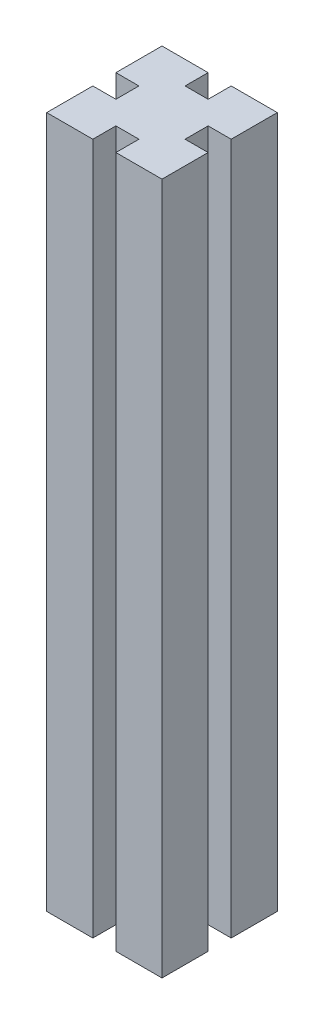
ISO-10303-21;
HEADER;
FILE_DESCRIPTION(('STEP AP214'),'2;1');
FILE_NAME('part.step','',(''),(''),'','','');
FILE_SCHEMA(('AUTOMOTIVE_DESIGN { 1 0 10303 214 1 1 1 1 }'));
ENDSEC;
DATA;
#1=APPLICATION_CONTEXT('core data for automotive mechanical design processes');
#2=APPLICATION_PROTOCOL_DEFINITION('international standard','automotive_design',2000,#1);
#3=PRODUCT_CONTEXT('',#1,'mechanical');
#4=PRODUCT('Part','Part','',(#3));
#5=PRODUCT_RELATED_PRODUCT_CATEGORY('part','',(#4));
#6=PRODUCT_DEFINITION_FORMATION('','',#4);
#7=PRODUCT_DEFINITION_CONTEXT('part definition',#1,'design');
#8=PRODUCT_DEFINITION('design','',#6,#7);
#9=PRODUCT_DEFINITION_SHAPE('','',#8);
#10=(LENGTH_UNIT() NAMED_UNIT(*) SI_UNIT(.MILLI.,.METRE.));
#11=(NAMED_UNIT(*) PLANE_ANGLE_UNIT() SI_UNIT($,.RADIAN.));
#12=(NAMED_UNIT(*) SI_UNIT($,.STERADIAN.) SOLID_ANGLE_UNIT());
#13=UNCERTAINTY_MEASURE_WITH_UNIT(LENGTH_MEASURE(1.E-05),#10,'distance_accuracy_value','');
#14=(GEOMETRIC_REPRESENTATION_CONTEXT(3) GLOBAL_UNCERTAINTY_ASSIGNED_CONTEXT((#13)) GLOBAL_UNIT_ASSIGNED_CONTEXT((#10,
#11,#12)) REPRESENTATION_CONTEXT('',''));
#15=CARTESIAN_POINT('',(0.,0.,0.));
#16=DIRECTION('',(0.,0.,1.));
#17=DIRECTION('',(1.,0.,0.));
#18=AXIS2_PLACEMENT_3D('',#15,#16,#17);
#19=CARTESIAN_POINT('',(12.5,150.,-12.5));
#20=DIRECTION('',(-1.,0.,0.));
#21=DIRECTION('',(0.,0.,1.));
#22=AXIS2_PLACEMENT_3D('',#19,#20,#21);
#23=PLANE('',#22);
#24=DIRECTION('',(0.,0.,-1.));
#25=VECTOR('',#24,1.);
#26=CARTESIAN_POINT('',(12.5,0.,-12.5));
#27=LINE('',#26,#25);
#28=CARTESIAN_POINT('',(12.5,0.,12.5));
#29=VERTEX_POINT('',#28);
#30=CARTESIAN_POINT('',(12.5,0.,2.50000000000001));
#31=VERTEX_POINT('',#30);
#32=EDGE_CURVE('E288',#29,#31,#27,.T.);
#33=ORIENTED_EDGE('',*,*,#32,.T.);
#34=DIRECTION('',(0.,1.,0.));
#35=VECTOR('',#34,1.);
#36=CARTESIAN_POINT('',(12.5,150.,2.50000000000001));
#37=LINE('',#36,#35);
#38=CARTESIAN_POINT('',(12.5,150.,2.50000000000001));
#39=VERTEX_POINT('',#38);
#40=EDGE_CURVE('E183',#31,#39,#37,.T.);
#41=ORIENTED_EDGE('',*,*,#40,.T.);
#42=DIRECTION('',(0.,0.,-1.));
#43=VECTOR('',#42,1.);
#44=CARTESIAN_POINT('',(12.5,150.,-12.5));
#45=LINE('',#44,#43);
#46=CARTESIAN_POINT('',(12.5,150.,12.5));
#47=VERTEX_POINT('',#46);
#48=EDGE_CURVE('E271',#47,#39,#45,.T.);
#49=ORIENTED_EDGE('',*,*,#48,.F.);
#50=DIRECTION('',(0.,-1.,0.));
#51=VECTOR('',#50,1.);
#52=CARTESIAN_POINT('',(12.5,150.,12.5));
#53=LINE('',#52,#51);
#54=EDGE_CURVE('E287',#47,#29,#53,.T.);
#55=ORIENTED_EDGE('',*,*,#54,.T.);
#56=EDGE_LOOP('',(#33,#41,#49,#55));
#57=FACE_BOUND('',#56,.T.);
#58=ADVANCED_FACE('F32',(#57),#23,.F.);
#59=CARTESIAN_POINT('',(-12.5,150.,-12.5));
#60=DIRECTION('',(1.,0.,0.));
#61=DIRECTION('',(0.,0.,-1.));
#62=AXIS2_PLACEMENT_3D('',#59,#60,#61);
#63=PLANE('',#62);
#64=DIRECTION('',(0.,0.,1.));
#65=VECTOR('',#64,1.);
#66=CARTESIAN_POINT('',(-12.5,0.,-12.5));
#67=LINE('',#66,#65);
#68=CARTESIAN_POINT('',(-12.5,0.,-12.5));
#69=VERTEX_POINT('',#68);
#70=CARTESIAN_POINT('',(-12.5,0.,-2.5));
#71=VERTEX_POINT('',#70);
#72=EDGE_CURVE('E295',#69,#71,#67,.T.);
#73=ORIENTED_EDGE('',*,*,#72,.T.);
#74=DIRECTION('',(0.,1.,0.));
#75=VECTOR('',#74,1.);
#76=CARTESIAN_POINT('',(-12.5,150.,-2.5));
#77=LINE('',#76,#75);
#78=CARTESIAN_POINT('',(-12.5,150.,-2.5));
#79=VERTEX_POINT('',#78);
#80=EDGE_CURVE('E233',#71,#79,#77,.T.);
#81=ORIENTED_EDGE('',*,*,#80,.T.);
#82=DIRECTION('',(0.,0.,1.));
#83=VECTOR('',#82,1.);
#84=CARTESIAN_POINT('',(-12.5,150.,-12.5));
#85=LINE('',#84,#83);
#86=CARTESIAN_POINT('',(-12.5,150.,-12.5));
#87=VERTEX_POINT('',#86);
#88=EDGE_CURVE('E280',#87,#79,#85,.T.);
#89=ORIENTED_EDGE('',*,*,#88,.F.);
#90=DIRECTION('',(0.,-1.,0.));
#91=VECTOR('',#90,1.);
#92=CARTESIAN_POINT('',(-12.5,150.,-12.5));
#93=LINE('',#92,#91);
#94=EDGE_CURVE('E307',#87,#69,#93,.T.);
#95=ORIENTED_EDGE('',*,*,#94,.T.);
#96=EDGE_LOOP('',(#73,#81,#89,#95));
#97=FACE_BOUND('',#96,.T.);
#98=ADVANCED_FACE('F358',(#97),#63,.F.);
#99=CARTESIAN_POINT('',(-12.5,150.,12.5));
#100=DIRECTION('',(0.,0.,-1.));
#101=DIRECTION('',(-1.,0.,0.));
#102=AXIS2_PLACEMENT_3D('',#99,#100,#101);
#103=PLANE('',#102);
#104=DIRECTION('',(1.,0.,0.));
#105=VECTOR('',#104,1.);
#106=CARTESIAN_POINT('',(-12.5,0.,12.5));
#107=LINE('',#106,#105);
#108=CARTESIAN_POINT('',(-12.5,0.,12.5));
#109=VERTEX_POINT('',#108);
#110=CARTESIAN_POINT('',(-2.5,0.,12.5));
#111=VERTEX_POINT('',#110);
#112=EDGE_CURVE('E299',#109,#111,#107,.T.);
#113=ORIENTED_EDGE('',*,*,#112,.T.);
#114=DIRECTION('',(0.,1.,0.));
#115=VECTOR('',#114,1.);
#116=CARTESIAN_POINT('',(-2.5,150.,12.5));
#117=LINE('',#116,#115);
#118=CARTESIAN_POINT('',(-2.5,150.,12.5));
#119=VERTEX_POINT('',#118);
#120=EDGE_CURVE('E239',#111,#119,#117,.T.);
#121=ORIENTED_EDGE('',*,*,#120,.T.);
#122=DIRECTION('',(1.,0.,0.));
#123=VECTOR('',#122,1.);
#124=CARTESIAN_POINT('',(-12.5,150.,12.5));
#125=LINE('',#124,#123);
#126=CARTESIAN_POINT('',(-12.5,150.,12.5));
#127=VERTEX_POINT('',#126);
#128=EDGE_CURVE('E284',#127,#119,#125,.T.);
#129=ORIENTED_EDGE('',*,*,#128,.F.);
#130=DIRECTION('',(0.,-1.,0.));
#131=VECTOR('',#130,1.);
#132=CARTESIAN_POINT('',(-12.5,150.,12.5));
#133=LINE('',#132,#131);
#134=EDGE_CURVE('E304',#127,#109,#133,.T.);
#135=ORIENTED_EDGE('',*,*,#134,.T.);
#136=EDGE_LOOP('',(#113,#121,#129,#135));
#137=FACE_BOUND('',#136,.T.);
#138=ADVANCED_FACE('F338',(#137),#103,.F.);
#139=CARTESIAN_POINT('',(-12.5,150.,-12.5));
#140=DIRECTION('',(0.,0.,1.));
#141=DIRECTION('',(1.,0.,0.));
#142=AXIS2_PLACEMENT_3D('',#139,#140,#141);
#143=PLANE('',#142);
#144=DIRECTION('',(-1.,0.,0.));
#145=VECTOR('',#144,1.);
#146=CARTESIAN_POINT('',(-12.5,0.,-12.5));
#147=LINE('',#146,#145);
#148=CARTESIAN_POINT('',(12.5,0.,-12.5));
#149=VERTEX_POINT('',#148);
#150=CARTESIAN_POINT('',(2.50000000000001,0.,-12.5));
#151=VERTEX_POINT('',#150);
#152=EDGE_CURVE('E291',#149,#151,#147,.T.);
#153=ORIENTED_EDGE('',*,*,#152,.T.);
#154=DIRECTION('',(0.,1.,0.));
#155=VECTOR('',#154,1.);
#156=CARTESIAN_POINT('',(2.50000000000001,150.,-12.5));
#157=LINE('',#156,#155);
#158=CARTESIAN_POINT('',(2.50000000000001,150.,-12.5));
#159=VERTEX_POINT('',#158);
#160=EDGE_CURVE('E267',#151,#159,#157,.T.);
#161=ORIENTED_EDGE('',*,*,#160,.T.);
#162=DIRECTION('',(-1.,0.,0.));
#163=VECTOR('',#162,1.);
#164=CARTESIAN_POINT('',(-12.5,150.,-12.5));
#165=LINE('',#164,#163);
#166=CARTESIAN_POINT('',(12.5,150.,-12.5));
#167=VERTEX_POINT('',#166);
#168=EDGE_CURVE('E276',#167,#159,#165,.T.);
#169=ORIENTED_EDGE('',*,*,#168,.F.);
#170=DIRECTION('',(0.,-1.,0.));
#171=VECTOR('',#170,1.);
#172=CARTESIAN_POINT('',(12.5,150.,-12.5));
#173=LINE('',#172,#171);
#174=EDGE_CURVE('E310',#167,#149,#173,.T.);
#175=ORIENTED_EDGE('',*,*,#174,.T.);
#176=EDGE_LOOP('',(#153,#161,#169,#175));
#177=FACE_BOUND('',#176,.T.);
#178=ADVANCED_FACE('F377',(#177),#143,.F.);
#179=CARTESIAN_POINT('',(12.5,150.,-2.49999999999999));
#180=VERTEX_POINT('',#179);
#181=EDGE_CURVE('E275',#180,#167,#45,.T.);
#182=ORIENTED_EDGE('',*,*,#181,.F.);
#183=DIRECTION('',(0.,-1.,0.));
#184=VECTOR('',#183,1.);
#185=CARTESIAN_POINT('',(12.5,150.,-2.5));
#186=LINE('',#185,#184);
#187=CARTESIAN_POINT('',(12.5,0.,-2.49999999999999));
#188=VERTEX_POINT('',#187);
#189=EDGE_CURVE('E242',#180,#188,#186,.T.);
#190=ORIENTED_EDGE('',*,*,#189,.T.);
#191=EDGE_CURVE('E270',#188,#149,#27,.T.);
#192=ORIENTED_EDGE('',*,*,#191,.T.);
#193=ORIENTED_EDGE('',*,*,#174,.F.);
#194=EDGE_LOOP('',(#182,#190,#192,#193));
#195=FACE_BOUND('',#194,.T.);
#196=ADVANCED_FACE('F34',(#195),#23,.F.);
#197=CARTESIAN_POINT('',(-2.49999999999999,150.,-12.5));
#198=VERTEX_POINT('',#197);
#199=EDGE_CURVE('E274',#198,#87,#165,.T.);
#200=ORIENTED_EDGE('',*,*,#199,.F.);
#201=DIRECTION('',(0.,-1.,0.));
#202=VECTOR('',#201,1.);
#203=CARTESIAN_POINT('',(-2.49999999999999,150.,-12.5));
#204=LINE('',#203,#202);
#205=CARTESIAN_POINT('',(-2.49999999999999,0.,-12.5));
#206=VERTEX_POINT('',#205);
#207=EDGE_CURVE('E262',#198,#206,#204,.T.);
#208=ORIENTED_EDGE('',*,*,#207,.T.);
#209=EDGE_CURVE('E290',#206,#69,#147,.T.);
#210=ORIENTED_EDGE('',*,*,#209,.T.);
#211=ORIENTED_EDGE('',*,*,#94,.F.);
#212=EDGE_LOOP('',(#200,#208,#210,#211));
#213=FACE_BOUND('',#212,.T.);
#214=ADVANCED_FACE('F363',(#213),#143,.F.);
#215=CARTESIAN_POINT('',(-12.5,150.,2.5));
#216=VERTEX_POINT('',#215);
#217=EDGE_CURVE('E279',#216,#127,#85,.T.);
#218=ORIENTED_EDGE('',*,*,#217,.F.);
#219=DIRECTION('',(0.,-1.,0.));
#220=VECTOR('',#219,1.);
#221=CARTESIAN_POINT('',(-12.5,150.,2.5));
#222=LINE('',#221,#220);
#223=CARTESIAN_POINT('',(-12.5,0.,2.5));
#224=VERTEX_POINT('',#223);
#225=EDGE_CURVE('E176',#216,#224,#222,.T.);
#226=ORIENTED_EDGE('',*,*,#225,.T.);
#227=EDGE_CURVE('E294',#224,#109,#67,.T.);
#228=ORIENTED_EDGE('',*,*,#227,.T.);
#229=ORIENTED_EDGE('',*,*,#134,.F.);
#230=EDGE_LOOP('',(#218,#226,#228,#229));
#231=FACE_BOUND('',#230,.T.);
#232=ADVANCED_FACE('F344',(#231),#63,.F.);
#233=CARTESIAN_POINT('',(2.5,150.,12.5));
#234=VERTEX_POINT('',#233);
#235=EDGE_CURVE('E283',#234,#47,#125,.T.);
#236=ORIENTED_EDGE('',*,*,#235,.F.);
#237=DIRECTION('',(0.,-1.,0.));
#238=VECTOR('',#237,1.);
#239=CARTESIAN_POINT('',(2.5,150.,12.5));
#240=LINE('',#239,#238);
#241=CARTESIAN_POINT('',(2.5,0.,12.5));
#242=VERTEX_POINT('',#241);
#243=EDGE_CURVE('E236',#234,#242,#240,.T.);
#244=ORIENTED_EDGE('',*,*,#243,.T.);
#245=EDGE_CURVE('E298',#242,#29,#107,.T.);
#246=ORIENTED_EDGE('',*,*,#245,.T.);
#247=ORIENTED_EDGE('',*,*,#54,.F.);
#248=EDGE_LOOP('',(#236,#244,#246,#247));
#249=FACE_BOUND('',#248,.T.);
#250=ADVANCED_FACE('F325',(#249),#103,.F.);
#251=CARTESIAN_POINT('',(0.,150.,0.));
#252=DIRECTION('',(0.,1.,0.));
#253=DIRECTION('',(0.,0.,1.));
#254=AXIS2_PLACEMENT_3D('',#251,#252,#253);
#255=PLANE('',#254);
#256=DIRECTION('',(1.,0.,0.));
#257=VECTOR('',#256,1.);
#258=CARTESIAN_POINT('',(17.5,150.,2.5));
#259=LINE('',#258,#257);
#260=CARTESIAN_POINT('',(7.5,150.,2.50000000000001));
#261=VERTEX_POINT('',#260);
#262=EDGE_CURVE('E193',#261,#39,#259,.T.);
#263=ORIENTED_EDGE('',*,*,#262,.F.);
#264=DIRECTION('',(0.,0.,1.));
#265=VECTOR('',#264,1.);
#266=CARTESIAN_POINT('',(7.5,150.,-2.49999999999999));
#267=LINE('',#266,#265);
#268=CARTESIAN_POINT('',(7.5,150.,-2.49999999999999));
#269=VERTEX_POINT('',#268);
#270=EDGE_CURVE('E173',#269,#261,#267,.T.);
#271=ORIENTED_EDGE('',*,*,#270,.F.);
#272=DIRECTION('',(-1.,0.,0.));
#273=VECTOR('',#272,1.);
#274=CARTESIAN_POINT('',(17.5,150.,-2.49999999999999));
#275=LINE('',#274,#273);
#276=EDGE_CURVE('E195',#180,#269,#275,.T.);
#277=ORIENTED_EDGE('',*,*,#276,.F.);
#278=ORIENTED_EDGE('',*,*,#181,.T.);
#279=ORIENTED_EDGE('',*,*,#168,.T.);
#280=DIRECTION('',(0.,0.,-1.));
#281=VECTOR('',#280,1.);
#282=CARTESIAN_POINT('',(2.50000000000001,150.,-17.5));
#283=LINE('',#282,#281);
#284=CARTESIAN_POINT('',(2.50000000000001,150.,-7.5));
#285=VERTEX_POINT('',#284);
#286=EDGE_CURVE('E246',#285,#159,#283,.T.);
#287=ORIENTED_EDGE('',*,*,#286,.F.);
#288=DIRECTION('',(1.,0.,0.));
#289=VECTOR('',#288,1.);
#290=CARTESIAN_POINT('',(-2.49999999999999,150.,-7.5));
#291=LINE('',#290,#289);
#292=CARTESIAN_POINT('',(-2.49999999999999,150.,-7.5));
#293=VERTEX_POINT('',#292);
#294=EDGE_CURVE('E251',#293,#285,#291,.T.);
#295=ORIENTED_EDGE('',*,*,#294,.F.);
#296=DIRECTION('',(0.,0.,1.));
#297=VECTOR('',#296,1.);
#298=CARTESIAN_POINT('',(-2.49999999999999,150.,-17.5));
#299=LINE('',#298,#297);
#300=EDGE_CURVE('E256',#198,#293,#299,.T.);
#301=ORIENTED_EDGE('',*,*,#300,.F.);
#302=ORIENTED_EDGE('',*,*,#199,.T.);
#303=ORIENTED_EDGE('',*,*,#88,.T.);
#304=DIRECTION('',(-1.,0.,0.));
#305=VECTOR('',#304,1.);
#306=CARTESIAN_POINT('',(-17.5,150.,-2.5));
#307=LINE('',#306,#305);
#308=CARTESIAN_POINT('',(-7.5,150.,-2.50000000000001));
#309=VERTEX_POINT('',#308);
#310=EDGE_CURVE('E222',#309,#79,#307,.T.);
#311=ORIENTED_EDGE('',*,*,#310,.F.);
#312=DIRECTION('',(0.,0.,-1.));
#313=VECTOR('',#312,1.);
#314=CARTESIAN_POINT('',(-7.5,150.,2.5));
#315=LINE('',#314,#313);
#316=CARTESIAN_POINT('',(-7.5,150.,2.5));
#317=VERTEX_POINT('',#316);
#318=EDGE_CURVE('E218',#317,#309,#315,.T.);
#319=ORIENTED_EDGE('',*,*,#318,.F.);
#320=DIRECTION('',(1.,0.,0.));
#321=VECTOR('',#320,1.);
#322=CARTESIAN_POINT('',(-17.5,150.,2.5));
#323=LINE('',#322,#321);
#324=EDGE_CURVE('E224',#216,#317,#323,.T.);
#325=ORIENTED_EDGE('',*,*,#324,.F.);
#326=ORIENTED_EDGE('',*,*,#217,.T.);
#327=ORIENTED_EDGE('',*,*,#128,.T.);
#328=DIRECTION('',(0.,0.,1.));
#329=VECTOR('',#328,1.);
#330=CARTESIAN_POINT('',(-2.5,150.,17.5));
#331=LINE('',#330,#329);
#332=CARTESIAN_POINT('',(-2.50000000000001,150.,7.5));
#333=VERTEX_POINT('',#332);
#334=EDGE_CURVE('E205',#333,#119,#331,.T.);
#335=ORIENTED_EDGE('',*,*,#334,.F.);
#336=DIRECTION('',(-1.,0.,0.));
#337=VECTOR('',#336,1.);
#338=CARTESIAN_POINT('',(2.5,150.,7.5));
#339=LINE('',#338,#337);
#340=CARTESIAN_POINT('',(2.5,150.,7.5));
#341=VERTEX_POINT('',#340);
#342=EDGE_CURVE('E202',#341,#333,#339,.T.);
#343=ORIENTED_EDGE('',*,*,#342,.F.);
#344=DIRECTION('',(0.,0.,-1.));
#345=VECTOR('',#344,1.);
#346=CARTESIAN_POINT('',(2.5,150.,17.5));
#347=LINE('',#346,#345);
#348=EDGE_CURVE('E207',#234,#341,#347,.T.);
#349=ORIENTED_EDGE('',*,*,#348,.F.);
#350=ORIENTED_EDGE('',*,*,#235,.T.);
#351=ORIENTED_EDGE('',*,*,#48,.T.);
#352=EDGE_LOOP('',(#263,#271,#277,#278,#279,#287,#295,#301,#302,#303,#311,#319,#325,#326,#327,
#335,#343,#349,#350,#351));
#353=FACE_BOUND('',#352,.T.);
#354=ADVANCED_FACE('F329',(#353),#255,.T.);
#355=CARTESIAN_POINT('',(0.,0.,0.));
#356=DIRECTION('',(0.,1.,0.));
#357=DIRECTION('',(0.,0.,1.));
#358=AXIS2_PLACEMENT_3D('',#355,#356,#357);
#359=PLANE('',#358);
#360=DIRECTION('',(0.,0.,1.));
#361=VECTOR('',#360,1.);
#362=CARTESIAN_POINT('',(7.5,0.,-2.49999999999999));
#363=LINE('',#362,#361);
#364=CARTESIAN_POINT('',(7.5,0.,-2.49999999999999));
#365=VERTEX_POINT('',#364);
#366=CARTESIAN_POINT('',(7.5,0.,2.50000000000001));
#367=VERTEX_POINT('',#366);
#368=EDGE_CURVE('E47',#365,#367,#363,.T.);
#369=ORIENTED_EDGE('',*,*,#368,.T.);
#370=DIRECTION('',(1.,0.,0.));
#371=VECTOR('',#370,1.);
#372=CARTESIAN_POINT('',(17.5,0.,2.5));
#373=LINE('',#372,#371);
#374=EDGE_CURVE('E180',#367,#31,#373,.T.);
#375=ORIENTED_EDGE('',*,*,#374,.T.);
#376=ORIENTED_EDGE('',*,*,#32,.F.);
#377=ORIENTED_EDGE('',*,*,#245,.F.);
#378=DIRECTION('',(0.,0.,-1.));
#379=VECTOR('',#378,1.);
#380=CARTESIAN_POINT('',(2.49999999999999,0.,0.));
#381=LINE('',#380,#379);
#382=CARTESIAN_POINT('',(2.5,0.,7.5));
#383=VERTEX_POINT('',#382);
#384=EDGE_CURVE('E40',#242,#383,#381,.T.);
#385=ORIENTED_EDGE('',*,*,#384,.T.);
#386=DIRECTION('',(-1.,0.,0.));
#387=VECTOR('',#386,1.);
#388=CARTESIAN_POINT('',(2.5,0.,7.5));
#389=LINE('',#388,#387);
#390=CARTESIAN_POINT('',(-2.50000000000001,0.,7.5));
#391=VERTEX_POINT('',#390);
#392=EDGE_CURVE('E55',#383,#391,#389,.T.);
#393=ORIENTED_EDGE('',*,*,#392,.T.);
#394=DIRECTION('',(0.,0.,1.));
#395=VECTOR('',#394,1.);
#396=CARTESIAN_POINT('',(-2.5,0.,17.5));
#397=LINE('',#396,#395);
#398=EDGE_CURVE('E199',#391,#111,#397,.T.);
#399=ORIENTED_EDGE('',*,*,#398,.T.);
#400=ORIENTED_EDGE('',*,*,#112,.F.);
#401=ORIENTED_EDGE('',*,*,#227,.F.);
#402=DIRECTION('',(1.,0.,0.));
#403=VECTOR('',#402,1.);
#404=CARTESIAN_POINT('',(0.,0.,2.49999999999999));
#405=LINE('',#404,#403);
#406=CARTESIAN_POINT('',(-7.5,0.,2.5));
#407=VERTEX_POINT('',#406);
#408=EDGE_CURVE('E316',#224,#407,#405,.T.);
#409=ORIENTED_EDGE('',*,*,#408,.T.);
#410=DIRECTION('',(0.,0.,-1.));
#411=VECTOR('',#410,1.);
#412=CARTESIAN_POINT('',(-7.5,0.,2.5));
#413=LINE('',#412,#411);
#414=CARTESIAN_POINT('',(-7.5,0.,-2.50000000000001));
#415=VERTEX_POINT('',#414);
#416=EDGE_CURVE('E217',#407,#415,#413,.T.);
#417=ORIENTED_EDGE('',*,*,#416,.T.);
#418=DIRECTION('',(-1.,0.,0.));
#419=VECTOR('',#418,1.);
#420=CARTESIAN_POINT('',(-17.5,0.,-2.5));
#421=LINE('',#420,#419);
#422=EDGE_CURVE('E214',#415,#71,#421,.T.);
#423=ORIENTED_EDGE('',*,*,#422,.T.);
#424=ORIENTED_EDGE('',*,*,#72,.F.);
#425=ORIENTED_EDGE('',*,*,#209,.F.);
#426=DIRECTION('',(0.,0.,1.));
#427=VECTOR('',#426,1.);
#428=CARTESIAN_POINT('',(-2.49999999999999,0.,0.));
#429=LINE('',#428,#427);
#430=CARTESIAN_POINT('',(-2.49999999999999,0.,-7.5));
#431=VERTEX_POINT('',#430);
#432=EDGE_CURVE('E313',#206,#431,#429,.T.);
#433=ORIENTED_EDGE('',*,*,#432,.T.);
#434=DIRECTION('',(1.,0.,0.));
#435=VECTOR('',#434,1.);
#436=CARTESIAN_POINT('',(-2.49999999999999,0.,-7.5));
#437=LINE('',#436,#435);
#438=CARTESIAN_POINT('',(2.50000000000001,0.,-7.5));
#439=VERTEX_POINT('',#438);
#440=EDGE_CURVE('E250',#431,#439,#437,.T.);
#441=ORIENTED_EDGE('',*,*,#440,.T.);
#442=DIRECTION('',(0.,0.,-1.));
#443=VECTOR('',#442,1.);
#444=CARTESIAN_POINT('',(2.50000000000001,0.,-17.5));
#445=LINE('',#444,#443);
#446=EDGE_CURVE('E247',#439,#151,#445,.T.);
#447=ORIENTED_EDGE('',*,*,#446,.T.);
#448=ORIENTED_EDGE('',*,*,#152,.F.);
#449=ORIENTED_EDGE('',*,*,#191,.F.);
#450=DIRECTION('',(-1.,0.,0.));
#451=VECTOR('',#450,1.);
#452=CARTESIAN_POINT('',(0.,0.,-2.49999999999999));
#453=LINE('',#452,#451);
#454=EDGE_CURVE('E11',#188,#365,#453,.T.);
#455=ORIENTED_EDGE('',*,*,#454,.T.);
#456=EDGE_LOOP('',(#369,#375,#376,#377,#385,#393,#399,#400,#401,#409,#417,#423,#424,#425,#433,
#441,#447,#448,#449,#455));
#457=FACE_BOUND('',#456,.T.);
#458=ADVANCED_FACE('F188',(#457),#359,.F.);
#459=CARTESIAN_POINT('',(2.50000000000001,0.,-17.5));
#460=DIRECTION('',(1.,0.,0.));
#461=DIRECTION('',(0.,0.,-1.));
#462=AXIS2_PLACEMENT_3D('',#459,#460,#461);
#463=PLANE('',#462);
#464=ORIENTED_EDGE('',*,*,#446,.F.);
#465=DIRECTION('',(0.,1.,0.));
#466=VECTOR('',#465,1.);
#467=CARTESIAN_POINT('',(2.50000000000001,0.,-7.5));
#468=LINE('',#467,#466);
#469=EDGE_CURVE('E260',#439,#285,#468,.T.);
#470=ORIENTED_EDGE('',*,*,#469,.T.);
#471=ORIENTED_EDGE('',*,*,#286,.T.);
#472=ORIENTED_EDGE('',*,*,#160,.F.);
#473=EDGE_LOOP('',(#464,#470,#471,#472));
#474=FACE_BOUND('',#473,.T.);
#475=ADVANCED_FACE('F375',(#474),#463,.F.);
#476=CARTESIAN_POINT('',(-2.49999999999999,0.,-17.5));
#477=DIRECTION('',(-1.,0.,0.));
#478=DIRECTION('',(0.,0.,1.));
#479=AXIS2_PLACEMENT_3D('',#476,#477,#478);
#480=PLANE('',#479);
#481=ORIENTED_EDGE('',*,*,#300,.T.);
#482=DIRECTION('',(0.,1.,0.));
#483=VECTOR('',#482,1.);
#484=CARTESIAN_POINT('',(-2.49999999999999,0.,-7.5));
#485=LINE('',#484,#483);
#486=EDGE_CURVE('E254',#431,#293,#485,.T.);
#487=ORIENTED_EDGE('',*,*,#486,.F.);
#488=ORIENTED_EDGE('',*,*,#432,.F.);
#489=ORIENTED_EDGE('',*,*,#207,.F.);
#490=EDGE_LOOP('',(#481,#487,#488,#489));
#491=FACE_BOUND('',#490,.T.);
#492=ADVANCED_FACE('F366',(#491),#480,.F.);
#493=CARTESIAN_POINT('',(-2.49999999999999,0.,-7.5));
#494=DIRECTION('',(0.,0.,1.));
#495=DIRECTION('',(1.,0.,0.));
#496=AXIS2_PLACEMENT_3D('',#493,#494,#495);
#497=PLANE('',#496);
#498=ORIENTED_EDGE('',*,*,#294,.T.);
#499=ORIENTED_EDGE('',*,*,#469,.F.);
#500=ORIENTED_EDGE('',*,*,#440,.F.);
#501=ORIENTED_EDGE('',*,*,#486,.T.);
#502=EDGE_LOOP('',(#498,#499,#500,#501));
#503=FACE_BOUND('',#502,.T.);
#504=ADVANCED_FACE('F370',(#503),#497,.F.);
#505=CARTESIAN_POINT('',(-17.5,0.,-2.5));
#506=DIRECTION('',(0.,0.,-1.));
#507=DIRECTION('',(-1.,0.,0.));
#508=AXIS2_PLACEMENT_3D('',#505,#506,#507);
#509=PLANE('',#508);
#510=ORIENTED_EDGE('',*,*,#422,.F.);
#511=DIRECTION('',(0.,1.,0.));
#512=VECTOR('',#511,1.);
#513=CARTESIAN_POINT('',(-7.5,0.,-2.50000000000001));
#514=LINE('',#513,#512);
#515=EDGE_CURVE('E208',#415,#309,#514,.T.);
#516=ORIENTED_EDGE('',*,*,#515,.T.);
#517=ORIENTED_EDGE('',*,*,#310,.T.);
#518=ORIENTED_EDGE('',*,*,#80,.F.);
#519=EDGE_LOOP('',(#510,#516,#517,#518));
#520=FACE_BOUND('',#519,.T.);
#521=ADVANCED_FACE('F413',(#520),#509,.F.);
#522=CARTESIAN_POINT('',(-17.5,0.,2.5));
#523=DIRECTION('',(0.,0.,1.));
#524=DIRECTION('',(1.,0.,0.));
#525=AXIS2_PLACEMENT_3D('',#522,#523,#524);
#526=PLANE('',#525);
#527=ORIENTED_EDGE('',*,*,#324,.T.);
#528=DIRECTION('',(0.,1.,0.));
#529=VECTOR('',#528,1.);
#530=CARTESIAN_POINT('',(-7.5,0.,2.5));
#531=LINE('',#530,#529);
#532=EDGE_CURVE('E221',#407,#317,#531,.T.);
#533=ORIENTED_EDGE('',*,*,#532,.F.);
#534=ORIENTED_EDGE('',*,*,#408,.F.);
#535=ORIENTED_EDGE('',*,*,#225,.F.);
#536=EDGE_LOOP('',(#527,#533,#534,#535));
#537=FACE_BOUND('',#536,.T.);
#538=ADVANCED_FACE('F347',(#537),#526,.F.);
#539=CARTESIAN_POINT('',(-7.5,0.,2.5));
#540=DIRECTION('',(1.,0.,0.));
#541=DIRECTION('',(0.,0.,-1.));
#542=AXIS2_PLACEMENT_3D('',#539,#540,#541);
#543=PLANE('',#542);
#544=ORIENTED_EDGE('',*,*,#318,.T.);
#545=ORIENTED_EDGE('',*,*,#515,.F.);
#546=ORIENTED_EDGE('',*,*,#416,.F.);
#547=ORIENTED_EDGE('',*,*,#532,.T.);
#548=EDGE_LOOP('',(#544,#545,#546,#547));
#549=FACE_BOUND('',#548,.T.);
#550=ADVANCED_FACE('F352',(#549),#543,.F.);
#551=CARTESIAN_POINT('',(-2.5,0.,17.5));
#552=DIRECTION('',(-1.,0.,0.));
#553=DIRECTION('',(0.,0.,1.));
#554=AXIS2_PLACEMENT_3D('',#551,#552,#553);
#555=PLANE('',#554);
#556=ORIENTED_EDGE('',*,*,#398,.F.);
#557=DIRECTION('',(0.,1.,0.));
#558=VECTOR('',#557,1.);
#559=CARTESIAN_POINT('',(-2.50000000000001,0.,7.5));
#560=LINE('',#559,#558);
#561=EDGE_CURVE('E196',#391,#333,#560,.T.);
#562=ORIENTED_EDGE('',*,*,#561,.T.);
#563=ORIENTED_EDGE('',*,*,#334,.T.);
#564=ORIENTED_EDGE('',*,*,#120,.F.);
#565=EDGE_LOOP('',(#556,#562,#563,#564));
#566=FACE_BOUND('',#565,.T.);
#567=ADVANCED_FACE('F336',(#566),#555,.F.);
#568=CARTESIAN_POINT('',(2.5,0.,17.5));
#569=DIRECTION('',(1.,0.,0.));
#570=DIRECTION('',(0.,0.,-1.));
#571=AXIS2_PLACEMENT_3D('',#568,#569,#570);
#572=PLANE('',#571);
#573=ORIENTED_EDGE('',*,*,#348,.T.);
#574=DIRECTION('',(0.,1.,0.));
#575=VECTOR('',#574,1.);
#576=CARTESIAN_POINT('',(2.5,0.,7.5));
#577=LINE('',#576,#575);
#578=EDGE_CURVE('E204',#383,#341,#577,.T.);
#579=ORIENTED_EDGE('',*,*,#578,.F.);
#580=ORIENTED_EDGE('',*,*,#384,.F.);
#581=ORIENTED_EDGE('',*,*,#243,.F.);
#582=EDGE_LOOP('',(#573,#579,#580,#581));
#583=FACE_BOUND('',#582,.T.);
#584=ADVANCED_FACE('F321',(#583),#572,.F.);
#585=CARTESIAN_POINT('',(2.5,0.,7.5));
#586=DIRECTION('',(0.,0.,-1.));
#587=DIRECTION('',(-1.,0.,0.));
#588=AXIS2_PLACEMENT_3D('',#585,#586,#587);
#589=PLANE('',#588);
#590=ORIENTED_EDGE('',*,*,#342,.T.);
#591=ORIENTED_EDGE('',*,*,#561,.F.);
#592=ORIENTED_EDGE('',*,*,#392,.F.);
#593=ORIENTED_EDGE('',*,*,#578,.T.);
#594=EDGE_LOOP('',(#590,#591,#592,#593));
#595=FACE_BOUND('',#594,.T.);
#596=ADVANCED_FACE('F332',(#595),#589,.F.);
#597=CARTESIAN_POINT('',(17.5,0.,2.5));
#598=DIRECTION('',(0.,0.,1.));
#599=DIRECTION('',(1.,0.,0.));
#600=AXIS2_PLACEMENT_3D('',#597,#598,#599);
#601=PLANE('',#600);
#602=ORIENTED_EDGE('',*,*,#374,.F.);
#603=DIRECTION('',(0.,1.,0.));
#604=VECTOR('',#603,1.);
#605=CARTESIAN_POINT('',(7.5,0.,2.50000000000001));
#606=LINE('',#605,#604);
#607=EDGE_CURVE('E169',#367,#261,#606,.T.);
#608=ORIENTED_EDGE('',*,*,#607,.T.);
#609=ORIENTED_EDGE('',*,*,#262,.T.);
#610=ORIENTED_EDGE('',*,*,#40,.F.);
#611=EDGE_LOOP('',(#602,#608,#609,#610));
#612=FACE_BOUND('',#611,.T.);
#613=ADVANCED_FACE('F181',(#612),#601,.F.);
#614=CARTESIAN_POINT('',(17.5,0.,-2.49999999999999));
#615=DIRECTION('',(0.,0.,-1.));
#616=DIRECTION('',(-1.,0.,0.));
#617=AXIS2_PLACEMENT_3D('',#614,#615,#616);
#618=PLANE('',#617);
#619=ORIENTED_EDGE('',*,*,#276,.T.);
#620=DIRECTION('',(0.,1.,0.));
#621=VECTOR('',#620,1.);
#622=CARTESIAN_POINT('',(7.5,0.,-2.49999999999999));
#623=LINE('',#622,#621);
#624=EDGE_CURVE('E177',#365,#269,#623,.T.);
#625=ORIENTED_EDGE('',*,*,#624,.F.);
#626=ORIENTED_EDGE('',*,*,#454,.F.);
#627=ORIENTED_EDGE('',*,*,#189,.F.);
#628=EDGE_LOOP('',(#619,#625,#626,#627));
#629=FACE_BOUND('',#628,.T.);
#630=ADVANCED_FACE('F384',(#629),#618,.F.);
#631=CARTESIAN_POINT('',(7.5,0.,-2.49999999999999));
#632=DIRECTION('',(-1.,0.,0.));
#633=DIRECTION('',(0.,0.,1.));
#634=AXIS2_PLACEMENT_3D('',#631,#632,#633);
#635=PLANE('',#634);
#636=ORIENTED_EDGE('',*,*,#270,.T.);
#637=ORIENTED_EDGE('',*,*,#607,.F.);
#638=ORIENTED_EDGE('',*,*,#368,.F.);
#639=ORIENTED_EDGE('',*,*,#624,.T.);
#640=EDGE_LOOP('',(#636,#637,#638,#639));
#641=FACE_BOUND('',#640,.T.);
#642=ADVANCED_FACE('F171',(#641),#635,.F.);
#643=CLOSED_SHELL('',(#58,#98,#138,#178,#196,#214,#232,#250,#354,#458,#475,#492,#504,#521,#538,
#550,#567,#584,#596,#613,#630,#642));
#644=MANIFOLD_SOLID_BREP('B2',#643);
#645=ADVANCED_BREP_SHAPE_REPRESENTATION('',(#18,#644),#14);
#646=SHAPE_DEFINITION_REPRESENTATION(#9,#645);
ENDSEC;
END-ISO-10303-21;
